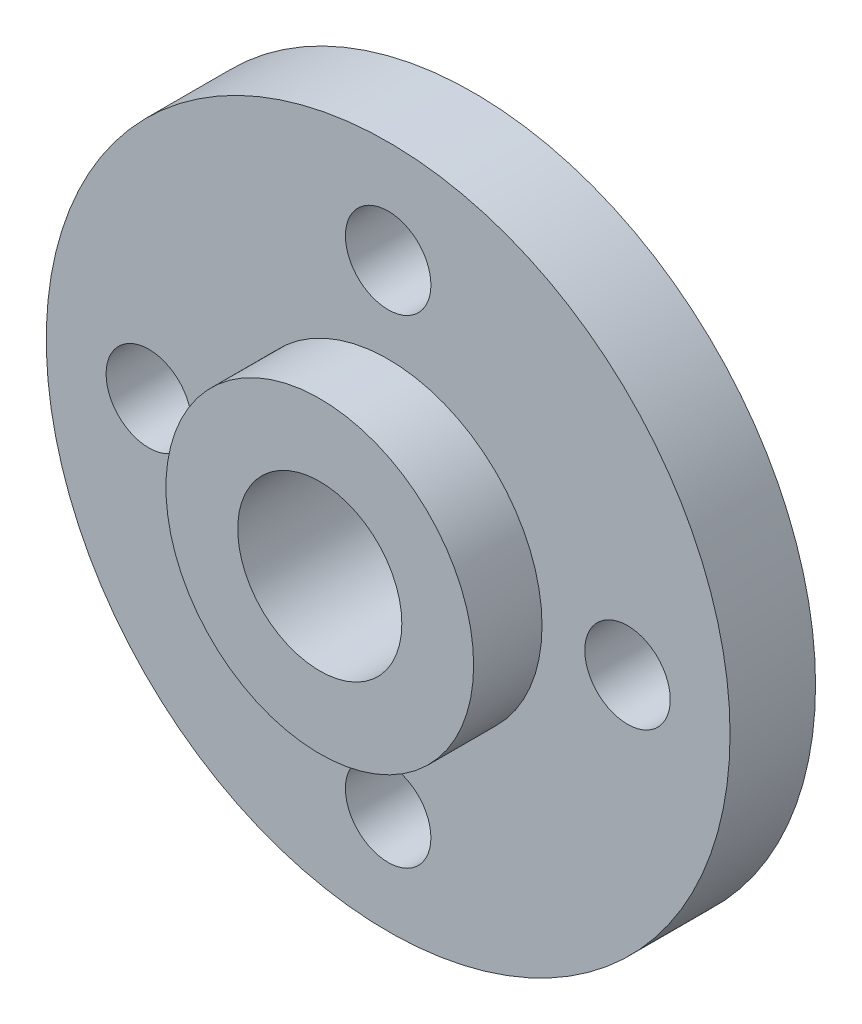
ISO-10303-21;
HEADER;
FILE_DESCRIPTION(('STEP AP214'),'2;1');
FILE_NAME('part.step','',(''),(''),'','','');
FILE_SCHEMA(('AUTOMOTIVE_DESIGN { 1 0 10303 214 1 1 1 1 }'));
ENDSEC;
DATA;
#1=APPLICATION_CONTEXT('core data for automotive mechanical design processes');
#2=APPLICATION_PROTOCOL_DEFINITION('international standard','automotive_design',2000,#1);
#3=PRODUCT_CONTEXT('',#1,'mechanical');
#4=PRODUCT('Part','Part','',(#3));
#5=PRODUCT_RELATED_PRODUCT_CATEGORY('part','',(#4));
#6=PRODUCT_DEFINITION_FORMATION('','',#4);
#7=PRODUCT_DEFINITION_CONTEXT('part definition',#1,'design');
#8=PRODUCT_DEFINITION('design','',#6,#7);
#9=PRODUCT_DEFINITION_SHAPE('','',#8);
#10=(LENGTH_UNIT() NAMED_UNIT(*) SI_UNIT(.MILLI.,.METRE.));
#11=(NAMED_UNIT(*) PLANE_ANGLE_UNIT() SI_UNIT($,.RADIAN.));
#12=(NAMED_UNIT(*) SI_UNIT($,.STERADIAN.) SOLID_ANGLE_UNIT());
#13=UNCERTAINTY_MEASURE_WITH_UNIT(LENGTH_MEASURE(1.E-05),#10,'distance_accuracy_value','');
#14=(GEOMETRIC_REPRESENTATION_CONTEXT(3) GLOBAL_UNCERTAINTY_ASSIGNED_CONTEXT((#13)) GLOBAL_UNIT_ASSIGNED_CONTEXT((#10,
#11,#12)) REPRESENTATION_CONTEXT('',''));
#15=CARTESIAN_POINT('',(0.,0.,0.));
#16=DIRECTION('',(0.,0.,1.));
#17=DIRECTION('',(1.,0.,0.));
#18=AXIS2_PLACEMENT_3D('',#15,#16,#17);
#19=CARTESIAN_POINT('',(0.,0.,2.5));
#20=DIRECTION('',(0.,0.,-1.));
#21=DIRECTION('',(-1.,0.,0.));
#22=AXIS2_PLACEMENT_3D('',#19,#20,#21);
#23=CYLINDRICAL_SURFACE('',#22,10.);
#24=CARTESIAN_POINT('',(0.,0.,2.5));
#25=DIRECTION('',(0.,0.,1.));
#26=DIRECTION('',(1.,0.,0.));
#27=AXIS2_PLACEMENT_3D('',#24,#25,#26);
#28=CIRCLE('',#27,10.);
#29=CARTESIAN_POINT('',(10.,0.,2.5));
#30=VERTEX_POINT('',#29);
#31=EDGE_CURVE('E44',#30,#30,#28,.T.);
#32=ORIENTED_EDGE('',*,*,#31,.F.);
#33=EDGE_LOOP('',(#32));
#34=FACE_BOUND('',#33,.T.);
#35=CARTESIAN_POINT('',(0.,0.,0.));
#36=DIRECTION('',(0.,0.,1.));
#37=DIRECTION('',(1.,0.,0.));
#38=AXIS2_PLACEMENT_3D('',#35,#36,#37);
#39=CIRCLE('',#38,10.);
#40=CARTESIAN_POINT('',(10.,0.,0.));
#41=VERTEX_POINT('',#40);
#42=EDGE_CURVE('E40',#41,#41,#39,.T.);
#43=ORIENTED_EDGE('',*,*,#42,.T.);
#44=EDGE_LOOP('',(#43));
#45=FACE_BOUND('',#44,.T.);
#46=ADVANCED_FACE('F37',(#34,#45),#23,.T.);
#47=CARTESIAN_POINT('',(0.,0.,2.5));
#48=DIRECTION('',(0.,0.,1.));
#49=DIRECTION('',(1.,0.,0.));
#50=AXIS2_PLACEMENT_3D('',#47,#48,#49);
#51=PLANE('',#50);
#52=CARTESIAN_POINT('',(0.,7.,2.5));
#53=DIRECTION('',(0.,0.,1.));
#54=DIRECTION('',(1.,0.,0.));
#55=AXIS2_PLACEMENT_3D('',#52,#53,#54);
#56=CIRCLE('',#55,1.25);
#57=CARTESIAN_POINT('',(1.25,7.,2.5));
#58=VERTEX_POINT('',#57);
#59=EDGE_CURVE('E57',#58,#58,#56,.T.);
#60=ORIENTED_EDGE('',*,*,#59,.F.);
#61=EDGE_LOOP('',(#60));
#62=FACE_BOUND('',#61,.T.);
#63=CARTESIAN_POINT('',(-7.,0.,2.5));
#64=DIRECTION('',(0.,0.,1.));
#65=DIRECTION('',(1.,0.,0.));
#66=AXIS2_PLACEMENT_3D('',#63,#64,#65);
#67=CIRCLE('',#66,1.25);
#68=CARTESIAN_POINT('',(-5.75,0.,2.5));
#69=VERTEX_POINT('',#68);
#70=EDGE_CURVE('E62',#69,#69,#67,.T.);
#71=ORIENTED_EDGE('',*,*,#70,.F.);
#72=EDGE_LOOP('',(#71));
#73=FACE_BOUND('',#72,.T.);
#74=CARTESIAN_POINT('',(0.,-7.,2.5));
#75=DIRECTION('',(0.,0.,1.));
#76=DIRECTION('',(1.,0.,0.));
#77=AXIS2_PLACEMENT_3D('',#74,#75,#76);
#78=CIRCLE('',#77,1.25);
#79=CARTESIAN_POINT('',(1.25,-7.,2.5));
#80=VERTEX_POINT('',#79);
#81=EDGE_CURVE('E65',#80,#80,#78,.T.);
#82=ORIENTED_EDGE('',*,*,#81,.F.);
#83=EDGE_LOOP('',(#82));
#84=FACE_BOUND('',#83,.T.);
#85=CARTESIAN_POINT('',(7.,0.,2.5));
#86=DIRECTION('',(0.,0.,1.));
#87=DIRECTION('',(1.,0.,0.));
#88=AXIS2_PLACEMENT_3D('',#85,#86,#87);
#89=CIRCLE('',#88,1.25);
#90=CARTESIAN_POINT('',(8.25,0.,2.5));
#91=VERTEX_POINT('',#90);
#92=EDGE_CURVE('E68',#91,#91,#89,.T.);
#93=ORIENTED_EDGE('',*,*,#92,.F.);
#94=EDGE_LOOP('',(#93));
#95=FACE_BOUND('',#94,.T.);
#96=CARTESIAN_POINT('',(0.,0.,2.5));
#97=DIRECTION('',(0.,0.,1.));
#98=DIRECTION('',(1.,0.,0.));
#99=AXIS2_PLACEMENT_3D('',#96,#97,#98);
#100=CIRCLE('',#99,4.5);
#101=CARTESIAN_POINT('',(4.5,0.,2.5));
#102=VERTEX_POINT('',#101);
#103=EDGE_CURVE('E10',#102,#102,#100,.T.);
#104=ORIENTED_EDGE('',*,*,#103,.F.);
#105=EDGE_LOOP('',(#104));
#106=FACE_BOUND('',#105,.T.);
#107=ORIENTED_EDGE('',*,*,#31,.T.);
#108=EDGE_LOOP('',(#107));
#109=FACE_BOUND('',#108,.T.);
#110=ADVANCED_FACE('F90',(#62,#73,#84,#95,#106,#109),#51,.T.);
#111=CARTESIAN_POINT('',(0.,0.,0.));
#112=DIRECTION('',(0.,0.,1.));
#113=DIRECTION('',(1.,0.,0.));
#114=AXIS2_PLACEMENT_3D('',#111,#112,#113);
#115=PLANE('',#114);
#116=CARTESIAN_POINT('',(0.,7.,0.));
#117=DIRECTION('',(0.,0.,-1.));
#118=DIRECTION('',(-1.,0.,0.));
#119=AXIS2_PLACEMENT_3D('',#116,#117,#118);
#120=CIRCLE('',#119,1.25);
#121=CARTESIAN_POINT('',(-1.25,7.,0.));
#122=VERTEX_POINT('',#121);
#123=EDGE_CURVE('E71',#122,#122,#120,.T.);
#124=ORIENTED_EDGE('',*,*,#123,.F.);
#125=EDGE_LOOP('',(#124));
#126=FACE_BOUND('',#125,.T.);
#127=CARTESIAN_POINT('',(-7.,0.,0.));
#128=DIRECTION('',(0.,0.,-1.));
#129=DIRECTION('',(-1.,0.,0.));
#130=AXIS2_PLACEMENT_3D('',#127,#128,#129);
#131=CIRCLE('',#130,1.25);
#132=CARTESIAN_POINT('',(-8.25,0.,0.));
#133=VERTEX_POINT('',#132);
#134=EDGE_CURVE('E78',#133,#133,#131,.T.);
#135=ORIENTED_EDGE('',*,*,#134,.F.);
#136=EDGE_LOOP('',(#135));
#137=FACE_BOUND('',#136,.T.);
#138=CARTESIAN_POINT('',(0.,-7.,0.));
#139=DIRECTION('',(0.,0.,-1.));
#140=DIRECTION('',(-1.,0.,0.));
#141=AXIS2_PLACEMENT_3D('',#138,#139,#140);
#142=CIRCLE('',#141,1.25);
#143=CARTESIAN_POINT('',(-1.25,-7.,0.));
#144=VERTEX_POINT('',#143);
#145=EDGE_CURVE('E75',#144,#144,#142,.T.);
#146=ORIENTED_EDGE('',*,*,#145,.F.);
#147=EDGE_LOOP('',(#146));
#148=FACE_BOUND('',#147,.T.);
#149=CARTESIAN_POINT('',(7.,0.,0.));
#150=DIRECTION('',(0.,0.,-1.));
#151=DIRECTION('',(-1.,0.,0.));
#152=AXIS2_PLACEMENT_3D('',#149,#150,#151);
#153=CIRCLE('',#152,1.25);
#154=CARTESIAN_POINT('',(5.75,0.,0.));
#155=VERTEX_POINT('',#154);
#156=EDGE_CURVE('E72',#155,#155,#153,.T.);
#157=ORIENTED_EDGE('',*,*,#156,.F.);
#158=EDGE_LOOP('',(#157));
#159=FACE_BOUND('',#158,.T.);
#160=CARTESIAN_POINT('',(0.,0.,0.));
#161=DIRECTION('',(0.,0.,1.));
#162=DIRECTION('',(1.,0.,0.));
#163=AXIS2_PLACEMENT_3D('',#160,#161,#162);
#164=CIRCLE('',#163,2.4);
#165=CARTESIAN_POINT('',(2.4,0.,0.));
#166=VERTEX_POINT('',#165);
#167=EDGE_CURVE('E53',#166,#166,#164,.T.);
#168=ORIENTED_EDGE('',*,*,#167,.T.);
#169=EDGE_LOOP('',(#168));
#170=FACE_BOUND('',#169,.T.);
#171=ORIENTED_EDGE('',*,*,#42,.F.);
#172=EDGE_LOOP('',(#171));
#173=FACE_BOUND('',#172,.T.);
#174=ADVANCED_FACE('F86',(#126,#137,#148,#159,#170,#173),#115,.F.);
#175=CARTESIAN_POINT('',(0.,0.,4.5));
#176=DIRECTION('',(0.,0.,-1.));
#177=DIRECTION('',(-1.,0.,0.));
#178=AXIS2_PLACEMENT_3D('',#175,#176,#177);
#179=CYLINDRICAL_SURFACE('',#178,4.5);
#180=CARTESIAN_POINT('',(0.,0.,4.5));
#181=DIRECTION('',(0.,0.,1.));
#182=DIRECTION('',(1.,0.,0.));
#183=AXIS2_PLACEMENT_3D('',#180,#181,#182);
#184=CIRCLE('',#183,4.5);
#185=CARTESIAN_POINT('',(4.5,0.,4.5));
#186=VERTEX_POINT('',#185);
#187=EDGE_CURVE('E50',#186,#186,#184,.T.);
#188=ORIENTED_EDGE('',*,*,#187,.F.);
#189=EDGE_LOOP('',(#188));
#190=FACE_BOUND('',#189,.T.);
#191=ORIENTED_EDGE('',*,*,#103,.T.);
#192=EDGE_LOOP('',(#191));
#193=FACE_BOUND('',#192,.T.);
#194=ADVANCED_FACE('F89',(#190,#193),#179,.T.);
#195=CARTESIAN_POINT('',(0.,0.,4.5));
#196=DIRECTION('',(0.,0.,1.));
#197=DIRECTION('',(1.,0.,0.));
#198=AXIS2_PLACEMENT_3D('',#195,#196,#197);
#199=PLANE('',#198);
#200=CARTESIAN_POINT('',(0.,0.,4.5));
#201=DIRECTION('',(0.,0.,1.));
#202=DIRECTION('',(1.,0.,0.));
#203=AXIS2_PLACEMENT_3D('',#200,#201,#202);
#204=CIRCLE('',#203,2.4);
#205=CARTESIAN_POINT('',(2.4,0.,4.5));
#206=VERTEX_POINT('',#205);
#207=EDGE_CURVE('E54',#206,#206,#204,.T.);
#208=ORIENTED_EDGE('',*,*,#207,.F.);
#209=EDGE_LOOP('',(#208));
#210=FACE_BOUND('',#209,.T.);
#211=ORIENTED_EDGE('',*,*,#187,.T.);
#212=EDGE_LOOP('',(#211));
#213=FACE_BOUND('',#212,.T.);
#214=ADVANCED_FACE('F119',(#210,#213),#199,.T.);
#215=CARTESIAN_POINT('',(0.,0.,0.));
#216=DIRECTION('',(0.,0.,1.));
#217=DIRECTION('',(1.,0.,0.));
#218=AXIS2_PLACEMENT_3D('',#215,#216,#217);
#219=CYLINDRICAL_SURFACE('',#218,2.4);
#220=ORIENTED_EDGE('',*,*,#167,.F.);
#221=EDGE_LOOP('',(#220));
#222=FACE_BOUND('',#221,.T.);
#223=ORIENTED_EDGE('',*,*,#207,.T.);
#224=EDGE_LOOP('',(#223));
#225=FACE_BOUND('',#224,.T.);
#226=ADVANCED_FACE('F123',(#222,#225),#219,.F.);
#227=CARTESIAN_POINT('',(7.,0.,4.5));
#228=DIRECTION('',(0.,0.,-1.));
#229=DIRECTION('',(-1.,0.,0.));
#230=AXIS2_PLACEMENT_3D('',#227,#228,#229);
#231=CYLINDRICAL_SURFACE('',#230,1.25);
#232=ORIENTED_EDGE('',*,*,#92,.T.);
#233=EDGE_LOOP('',(#232));
#234=FACE_BOUND('',#233,.T.);
#235=ORIENTED_EDGE('',*,*,#156,.T.);
#236=EDGE_LOOP('',(#235));
#237=FACE_BOUND('',#236,.T.);
#238=ADVANCED_FACE('F126',(#234,#237),#231,.F.);
#239=CARTESIAN_POINT('',(0.,-7.,4.5));
#240=DIRECTION('',(0.,0.,-1.));
#241=DIRECTION('',(-1.,0.,0.));
#242=AXIS2_PLACEMENT_3D('',#239,#240,#241);
#243=CYLINDRICAL_SURFACE('',#242,1.25);
#244=ORIENTED_EDGE('',*,*,#81,.T.);
#245=EDGE_LOOP('',(#244));
#246=FACE_BOUND('',#245,.T.);
#247=ORIENTED_EDGE('',*,*,#145,.T.);
#248=EDGE_LOOP('',(#247));
#249=FACE_BOUND('',#248,.T.);
#250=ADVANCED_FACE('F130',(#246,#249),#243,.F.);
#251=CARTESIAN_POINT('',(-7.,0.,4.5));
#252=DIRECTION('',(0.,0.,-1.));
#253=DIRECTION('',(-1.,0.,0.));
#254=AXIS2_PLACEMENT_3D('',#251,#252,#253);
#255=CYLINDRICAL_SURFACE('',#254,1.25);
#256=ORIENTED_EDGE('',*,*,#70,.T.);
#257=EDGE_LOOP('',(#256));
#258=FACE_BOUND('',#257,.T.);
#259=ORIENTED_EDGE('',*,*,#134,.T.);
#260=EDGE_LOOP('',(#259));
#261=FACE_BOUND('',#260,.T.);
#262=ADVANCED_FACE('F134',(#258,#261),#255,.F.);
#263=CARTESIAN_POINT('',(0.,7.,4.5));
#264=DIRECTION('',(0.,0.,-1.));
#265=DIRECTION('',(-1.,0.,0.));
#266=AXIS2_PLACEMENT_3D('',#263,#264,#265);
#267=CYLINDRICAL_SURFACE('',#266,1.25);
#268=ORIENTED_EDGE('',*,*,#59,.T.);
#269=EDGE_LOOP('',(#268));
#270=FACE_BOUND('',#269,.T.);
#271=ORIENTED_EDGE('',*,*,#123,.T.);
#272=EDGE_LOOP('',(#271));
#273=FACE_BOUND('',#272,.T.);
#274=ADVANCED_FACE('F84',(#270,#273),#267,.F.);
#275=CLOSED_SHELL('',(#46,#110,#174,#194,#214,#226,#238,#250,#262,#274));
#276=MANIFOLD_SOLID_BREP('B2',#275);
#277=ADVANCED_BREP_SHAPE_REPRESENTATION('',(#18,#276),#14);
#278=SHAPE_DEFINITION_REPRESENTATION(#9,#277);
ENDSEC;
END-ISO-10303-21;
